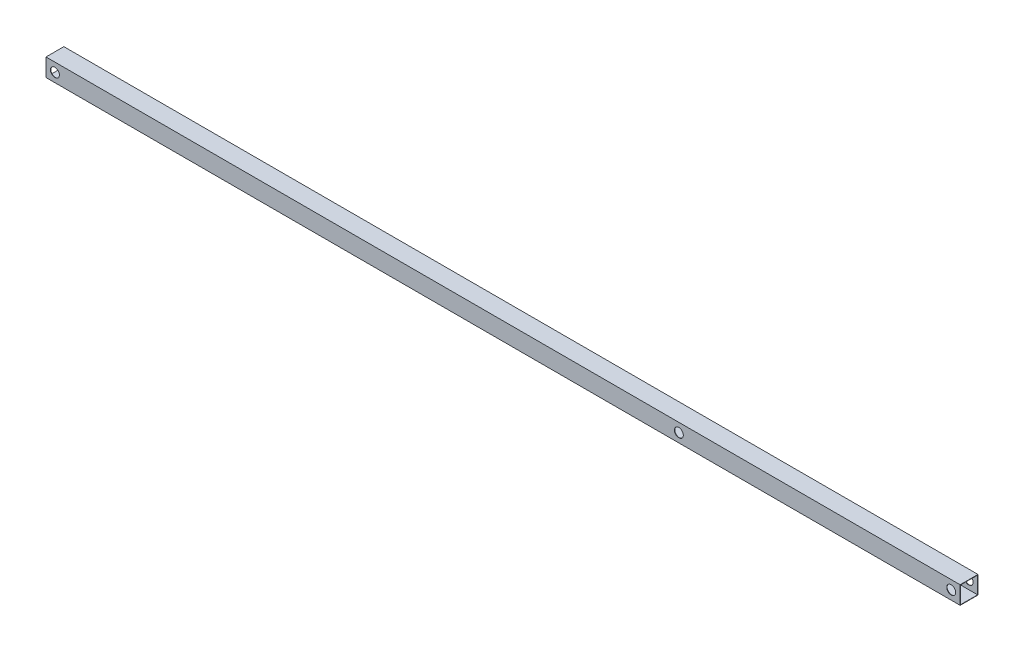
ISO-10303-21;
HEADER;
FILE_DESCRIPTION(('STEP AP214'),'2;1');
FILE_NAME('part.step','',(''),(''),'','','');
FILE_SCHEMA(('AUTOMOTIVE_DESIGN { 1 0 10303 214 1 1 1 1 }'));
ENDSEC;
DATA;
#1=APPLICATION_CONTEXT('core data for automotive mechanical design processes');
#2=APPLICATION_PROTOCOL_DEFINITION('international standard','automotive_design',2000,#1);
#3=PRODUCT_CONTEXT('',#1,'mechanical');
#4=PRODUCT('Part','Part','',(#3));
#5=PRODUCT_RELATED_PRODUCT_CATEGORY('part','',(#4));
#6=PRODUCT_DEFINITION_FORMATION('','',#4);
#7=PRODUCT_DEFINITION_CONTEXT('part definition',#1,'design');
#8=PRODUCT_DEFINITION('design','',#6,#7);
#9=PRODUCT_DEFINITION_SHAPE('','',#8);
#10=(LENGTH_UNIT() NAMED_UNIT(*) SI_UNIT(.MILLI.,.METRE.));
#11=(NAMED_UNIT(*) PLANE_ANGLE_UNIT() SI_UNIT($,.RADIAN.));
#12=(NAMED_UNIT(*) SI_UNIT($,.STERADIAN.) SOLID_ANGLE_UNIT());
#13=UNCERTAINTY_MEASURE_WITH_UNIT(LENGTH_MEASURE(1.E-05),#10,'distance_accuracy_value','');
#14=(GEOMETRIC_REPRESENTATION_CONTEXT(3) GLOBAL_UNCERTAINTY_ASSIGNED_CONTEXT((#13)) GLOBAL_UNIT_ASSIGNED_CONTEXT((#10,
#11,#12)) REPRESENTATION_CONTEXT('',''));
#15=CARTESIAN_POINT('',(0.,0.,0.));
#16=DIRECTION('',(0.,0.,1.));
#17=DIRECTION('',(1.,0.,0.));
#18=AXIS2_PLACEMENT_3D('',#15,#16,#17);
#19=CARTESIAN_POINT('',(1300.,12.7,12.7));
#20=DIRECTION('',(0.,-1.,0.));
#21=DIRECTION('',(0.,0.,-1.));
#22=AXIS2_PLACEMENT_3D('',#19,#20,#21);
#23=PLANE('',#22);
#24=DIRECTION('',(0.,0.,1.));
#25=VECTOR('',#24,1.);
#26=CARTESIAN_POINT('',(0.,12.7,12.7));
#27=LINE('',#26,#25);
#28=CARTESIAN_POINT('',(0.,12.7,-12.7));
#29=VERTEX_POINT('',#28);
#30=CARTESIAN_POINT('',(0.,12.7,12.7));
#31=VERTEX_POINT('',#30);
#32=EDGE_CURVE('E159',#29,#31,#27,.T.);
#33=ORIENTED_EDGE('',*,*,#32,.T.);
#34=DIRECTION('',(-1.,0.,0.));
#35=VECTOR('',#34,1.);
#36=CARTESIAN_POINT('',(1300.,12.7,12.7));
#37=LINE('',#36,#35);
#38=CARTESIAN_POINT('',(1300.,12.7,12.7));
#39=VERTEX_POINT('',#38);
#40=EDGE_CURVE('E12',#39,#31,#37,.T.);
#41=ORIENTED_EDGE('',*,*,#40,.F.);
#42=DIRECTION('',(0.,0.,1.));
#43=VECTOR('',#42,1.);
#44=CARTESIAN_POINT('',(1300.,12.7,12.7));
#45=LINE('',#44,#43);
#46=CARTESIAN_POINT('',(1300.,12.7,-12.7));
#47=VERTEX_POINT('',#46);
#48=EDGE_CURVE('E132',#47,#39,#45,.T.);
#49=ORIENTED_EDGE('',*,*,#48,.F.);
#50=DIRECTION('',(-1.,0.,0.));
#51=VECTOR('',#50,1.);
#52=CARTESIAN_POINT('',(1300.,12.7,-12.7));
#53=LINE('',#52,#51);
#54=EDGE_CURVE('E166',#47,#29,#53,.T.);
#55=ORIENTED_EDGE('',*,*,#54,.T.);
#56=EDGE_LOOP('',(#33,#41,#49,#55));
#57=FACE_BOUND('',#56,.T.);
#58=ADVANCED_FACE('F51',(#57),#23,.F.);
#59=CARTESIAN_POINT('',(1300.,12.7,12.7));
#60=DIRECTION('',(0.,0.,-1.));
#61=DIRECTION('',(-1.,0.,0.));
#62=AXIS2_PLACEMENT_3D('',#59,#60,#61);
#63=PLANE('',#62);
#64=CARTESIAN_POINT('',(900.,0.,12.7));
#65=DIRECTION('',(0.,0.,1.));
#66=DIRECTION('',(1.,0.,0.));
#67=AXIS2_PLACEMENT_3D('',#64,#65,#66);
#68=CIRCLE('',#67,6.34999999999994);
#69=CARTESIAN_POINT('',(906.35,0.,12.7));
#70=VERTEX_POINT('',#69);
#71=EDGE_CURVE('E229',#70,#70,#68,.T.);
#72=ORIENTED_EDGE('',*,*,#71,.F.);
#73=EDGE_LOOP('',(#72));
#74=FACE_BOUND('',#73,.T.);
#75=CARTESIAN_POINT('',(12.7,0.,12.7));
#76=DIRECTION('',(0.,0.,1.));
#77=DIRECTION('',(1.,0.,0.));
#78=AXIS2_PLACEMENT_3D('',#75,#76,#77);
#79=CIRCLE('',#78,6.35);
#80=CARTESIAN_POINT('',(19.05,0.,12.7));
#81=VERTEX_POINT('',#80);
#82=EDGE_CURVE('E223',#81,#81,#79,.T.);
#83=ORIENTED_EDGE('',*,*,#82,.F.);
#84=EDGE_LOOP('',(#83));
#85=FACE_BOUND('',#84,.T.);
#86=CARTESIAN_POINT('',(1287.3,0.,12.7));
#87=DIRECTION('',(0.,0.,1.));
#88=DIRECTION('',(1.,0.,0.));
#89=AXIS2_PLACEMENT_3D('',#86,#87,#88);
#90=CIRCLE('',#89,6.34999999999993);
#91=CARTESIAN_POINT('',(1293.65,0.,12.7));
#92=VERTEX_POINT('',#91);
#93=EDGE_CURVE('E205',#92,#92,#90,.T.);
#94=ORIENTED_EDGE('',*,*,#93,.F.);
#95=EDGE_LOOP('',(#94));
#96=FACE_BOUND('',#95,.T.);
#97=DIRECTION('',(0.,-1.,0.));
#98=VECTOR('',#97,1.);
#99=CARTESIAN_POINT('',(0.,12.7,12.7));
#100=LINE('',#99,#98);
#101=CARTESIAN_POINT('',(0.,-12.7,12.7));
#102=VERTEX_POINT('',#101);
#103=EDGE_CURVE('E137',#31,#102,#100,.T.);
#104=ORIENTED_EDGE('',*,*,#103,.T.);
#105=DIRECTION('',(-1.,0.,0.));
#106=VECTOR('',#105,1.);
#107=CARTESIAN_POINT('',(1300.,-12.7,12.7));
#108=LINE('',#107,#106);
#109=CARTESIAN_POINT('',(1300.,-12.7,12.7));
#110=VERTEX_POINT('',#109);
#111=EDGE_CURVE('E61',#110,#102,#108,.T.);
#112=ORIENTED_EDGE('',*,*,#111,.F.);
#113=DIRECTION('',(0.,-1.,0.));
#114=VECTOR('',#113,1.);
#115=CARTESIAN_POINT('',(1300.,12.7,12.7));
#116=LINE('',#115,#114);
#117=EDGE_CURVE('E126',#39,#110,#116,.T.);
#118=ORIENTED_EDGE('',*,*,#117,.F.);
#119=ORIENTED_EDGE('',*,*,#40,.T.);
#120=EDGE_LOOP('',(#104,#112,#118,#119));
#121=FACE_BOUND('',#120,.T.);
#122=ADVANCED_FACE('F136',(#74,#85,#96,#121),#63,.F.);
#123=CARTESIAN_POINT('',(1300.,-12.7,-12.7));
#124=DIRECTION('',(0.,1.,0.));
#125=DIRECTION('',(0.,0.,1.));
#126=AXIS2_PLACEMENT_3D('',#123,#124,#125);
#127=PLANE('',#126);
#128=DIRECTION('',(0.,0.,-1.));
#129=VECTOR('',#128,1.);
#130=CARTESIAN_POINT('',(0.,-12.7,-12.7));
#131=LINE('',#130,#129);
#132=CARTESIAN_POINT('',(0.,-12.7,-12.7));
#133=VERTEX_POINT('',#132);
#134=EDGE_CURVE('E99',#102,#133,#131,.T.);
#135=ORIENTED_EDGE('',*,*,#134,.T.);
#136=DIRECTION('',(-1.,0.,0.));
#137=VECTOR('',#136,1.);
#138=CARTESIAN_POINT('',(1300.,-12.7,-12.7));
#139=LINE('',#138,#137);
#140=CARTESIAN_POINT('',(1300.,-12.7,-12.7));
#141=VERTEX_POINT('',#140);
#142=EDGE_CURVE('E138',#141,#133,#139,.T.);
#143=ORIENTED_EDGE('',*,*,#142,.F.);
#144=DIRECTION('',(0.,0.,-1.));
#145=VECTOR('',#144,1.);
#146=CARTESIAN_POINT('',(1300.,-12.7,-12.7));
#147=LINE('',#146,#145);
#148=EDGE_CURVE('E130',#110,#141,#147,.T.);
#149=ORIENTED_EDGE('',*,*,#148,.F.);
#150=ORIENTED_EDGE('',*,*,#111,.T.);
#151=EDGE_LOOP('',(#135,#143,#149,#150));
#152=FACE_BOUND('',#151,.T.);
#153=ADVANCED_FACE('F140',(#152),#127,.F.);
#154=CARTESIAN_POINT('',(1300.,12.1412,12.1412));
#155=DIRECTION('',(0.,0.,-1.));
#156=DIRECTION('',(-1.,0.,0.));
#157=AXIS2_PLACEMENT_3D('',#154,#155,#156);
#158=PLANE('',#157);
#159=CARTESIAN_POINT('',(900.,0.,12.1412));
#160=DIRECTION('',(0.,0.,-1.));
#161=DIRECTION('',(-1.,0.,0.));
#162=AXIS2_PLACEMENT_3D('',#159,#160,#161);
#163=CIRCLE('',#162,6.34999999999994);
#164=CARTESIAN_POINT('',(893.65,0.,12.1412));
#165=VERTEX_POINT('',#164);
#166=EDGE_CURVE('E208',#165,#165,#163,.T.);
#167=ORIENTED_EDGE('',*,*,#166,.F.);
#168=EDGE_LOOP('',(#167));
#169=FACE_BOUND('',#168,.T.);
#170=CARTESIAN_POINT('',(12.7,0.,12.1412));
#171=DIRECTION('',(0.,0.,-1.));
#172=DIRECTION('',(-1.,0.,0.));
#173=AXIS2_PLACEMENT_3D('',#170,#171,#172);
#174=CIRCLE('',#173,6.35);
#175=CARTESIAN_POINT('',(6.35,0.,12.1412));
#176=VERTEX_POINT('',#175);
#177=EDGE_CURVE('E216',#176,#176,#174,.T.);
#178=ORIENTED_EDGE('',*,*,#177,.F.);
#179=EDGE_LOOP('',(#178));
#180=FACE_BOUND('',#179,.T.);
#181=CARTESIAN_POINT('',(1287.3,0.,12.1412));
#182=DIRECTION('',(0.,0.,-1.));
#183=DIRECTION('',(-1.,0.,0.));
#184=AXIS2_PLACEMENT_3D('',#181,#182,#183);
#185=CIRCLE('',#184,6.34999999999993);
#186=CARTESIAN_POINT('',(1280.95,0.,12.1412));
#187=VERTEX_POINT('',#186);
#188=EDGE_CURVE('E150',#187,#187,#185,.T.);
#189=ORIENTED_EDGE('',*,*,#188,.F.);
#190=EDGE_LOOP('',(#189));
#191=FACE_BOUND('',#190,.T.);
#192=DIRECTION('',(0.,-1.,0.));
#193=VECTOR('',#192,1.);
#194=CARTESIAN_POINT('',(0.,12.1412,12.1412));
#195=LINE('',#194,#193);
#196=CARTESIAN_POINT('',(0.,12.1412,12.1412));
#197=VERTEX_POINT('',#196);
#198=CARTESIAN_POINT('',(0.,-12.1412,12.1412));
#199=VERTEX_POINT('',#198);
#200=EDGE_CURVE('E146',#197,#199,#195,.T.);
#201=ORIENTED_EDGE('',*,*,#200,.F.);
#202=DIRECTION('',(-1.,0.,0.));
#203=VECTOR('',#202,1.);
#204=CARTESIAN_POINT('',(1300.,12.1412,12.1412));
#205=LINE('',#204,#203);
#206=CARTESIAN_POINT('',(1300.,12.1412,12.1412));
#207=VERTEX_POINT('',#206);
#208=EDGE_CURVE('E55',#207,#197,#205,.T.);
#209=ORIENTED_EDGE('',*,*,#208,.F.);
#210=DIRECTION('',(0.,-1.,0.));
#211=VECTOR('',#210,1.);
#212=CARTESIAN_POINT('',(1300.,12.1412,12.1412));
#213=LINE('',#212,#211);
#214=CARTESIAN_POINT('',(1300.,-12.1412,12.1412));
#215=VERTEX_POINT('',#214);
#216=EDGE_CURVE('E165',#207,#215,#213,.T.);
#217=ORIENTED_EDGE('',*,*,#216,.T.);
#218=DIRECTION('',(-1.,0.,0.));
#219=VECTOR('',#218,1.);
#220=CARTESIAN_POINT('',(1300.,-12.1412,12.1412));
#221=LINE('',#220,#219);
#222=EDGE_CURVE('E142',#215,#199,#221,.T.);
#223=ORIENTED_EDGE('',*,*,#222,.T.);
#224=EDGE_LOOP('',(#201,#209,#217,#223));
#225=FACE_BOUND('',#224,.T.);
#226=ADVANCED_FACE('F53',(#169,#180,#191,#225),#158,.T.);
#227=CARTESIAN_POINT('',(1300.,12.1412,12.1412));
#228=DIRECTION('',(0.,-1.,0.));
#229=DIRECTION('',(0.,0.,-1.));
#230=AXIS2_PLACEMENT_3D('',#227,#228,#229);
#231=PLANE('',#230);
#232=DIRECTION('',(0.,0.,1.));
#233=VECTOR('',#232,1.);
#234=CARTESIAN_POINT('',(0.,12.1412,12.1412));
#235=LINE('',#234,#233);
#236=CARTESIAN_POINT('',(0.,12.1412,-12.1412));
#237=VERTEX_POINT('',#236);
#238=EDGE_CURVE('E149',#237,#197,#235,.T.);
#239=ORIENTED_EDGE('',*,*,#238,.F.);
#240=DIRECTION('',(-1.,0.,0.));
#241=VECTOR('',#240,1.);
#242=CARTESIAN_POINT('',(1300.,12.1412,-12.1412));
#243=LINE('',#242,#241);
#244=CARTESIAN_POINT('',(1300.,12.1412,-12.1412));
#245=VERTEX_POINT('',#244);
#246=EDGE_CURVE('E171',#245,#237,#243,.T.);
#247=ORIENTED_EDGE('',*,*,#246,.F.);
#248=DIRECTION('',(0.,0.,1.));
#249=VECTOR('',#248,1.);
#250=CARTESIAN_POINT('',(1300.,12.1412,12.1412));
#251=LINE('',#250,#249);
#252=EDGE_CURVE('E180',#245,#207,#251,.T.);
#253=ORIENTED_EDGE('',*,*,#252,.T.);
#254=ORIENTED_EDGE('',*,*,#208,.T.);
#255=EDGE_LOOP('',(#239,#247,#253,#254));
#256=FACE_BOUND('',#255,.T.);
#257=ADVANCED_FACE('F178',(#256),#231,.T.);
#258=CARTESIAN_POINT('',(1300.,-12.1412,-12.1412));
#259=DIRECTION('',(0.,0.,1.));
#260=DIRECTION('',(1.,0.,0.));
#261=AXIS2_PLACEMENT_3D('',#258,#259,#260);
#262=PLANE('',#261);
#263=CARTESIAN_POINT('',(900.,0.,-12.1412));
#264=DIRECTION('',(0.,0.,1.));
#265=DIRECTION('',(1.,0.,0.));
#266=AXIS2_PLACEMENT_3D('',#263,#264,#265);
#267=CIRCLE('',#266,6.34999999999994);
#268=CARTESIAN_POINT('',(906.35,0.,-12.1412));
#269=VERTEX_POINT('',#268);
#270=EDGE_CURVE('E213',#269,#269,#267,.T.);
#271=ORIENTED_EDGE('',*,*,#270,.F.);
#272=EDGE_LOOP('',(#271));
#273=FACE_BOUND('',#272,.T.);
#274=CARTESIAN_POINT('',(12.7,0.,-12.1412));
#275=DIRECTION('',(0.,0.,1.));
#276=DIRECTION('',(1.,0.,0.));
#277=AXIS2_PLACEMENT_3D('',#274,#275,#276);
#278=CIRCLE('',#277,6.35);
#279=CARTESIAN_POINT('',(19.05,0.,-12.1412));
#280=VERTEX_POINT('',#279);
#281=EDGE_CURVE('E219',#280,#280,#278,.T.);
#282=ORIENTED_EDGE('',*,*,#281,.F.);
#283=EDGE_LOOP('',(#282));
#284=FACE_BOUND('',#283,.T.);
#285=CARTESIAN_POINT('',(1287.3,0.,-12.1412));
#286=DIRECTION('',(0.,0.,1.));
#287=DIRECTION('',(1.,0.,0.));
#288=AXIS2_PLACEMENT_3D('',#285,#286,#287);
#289=CIRCLE('',#288,6.34999999999993);
#290=CARTESIAN_POINT('',(1293.65,0.,-12.1412));
#291=VERTEX_POINT('',#290);
#292=EDGE_CURVE('E201',#291,#291,#289,.T.);
#293=ORIENTED_EDGE('',*,*,#292,.F.);
#294=EDGE_LOOP('',(#293));
#295=FACE_BOUND('',#294,.T.);
#296=DIRECTION('',(0.,1.,0.));
#297=VECTOR('',#296,1.);
#298=CARTESIAN_POINT('',(0.,-12.1412,-12.1412));
#299=LINE('',#298,#297);
#300=CARTESIAN_POINT('',(0.,-12.1412,-12.1412));
#301=VERTEX_POINT('',#300);
#302=EDGE_CURVE('E153',#301,#237,#299,.T.);
#303=ORIENTED_EDGE('',*,*,#302,.F.);
#304=DIRECTION('',(-1.,0.,0.));
#305=VECTOR('',#304,1.);
#306=CARTESIAN_POINT('',(1300.,-12.1412,-12.1412));
#307=LINE('',#306,#305);
#308=CARTESIAN_POINT('',(1300.,-12.1412,-12.1412));
#309=VERTEX_POINT('',#308);
#310=EDGE_CURVE('E170',#309,#301,#307,.T.);
#311=ORIENTED_EDGE('',*,*,#310,.F.);
#312=DIRECTION('',(0.,1.,0.));
#313=VECTOR('',#312,1.);
#314=CARTESIAN_POINT('',(1300.,-12.1412,-12.1412));
#315=LINE('',#314,#313);
#316=EDGE_CURVE('E187',#309,#245,#315,.T.);
#317=ORIENTED_EDGE('',*,*,#316,.T.);
#318=ORIENTED_EDGE('',*,*,#246,.T.);
#319=EDGE_LOOP('',(#303,#311,#317,#318));
#320=FACE_BOUND('',#319,.T.);
#321=ADVANCED_FACE('F185',(#273,#284,#295,#320),#262,.T.);
#322=CARTESIAN_POINT('',(1300.,-12.1412,-12.1412));
#323=DIRECTION('',(0.,1.,0.));
#324=DIRECTION('',(0.,0.,1.));
#325=AXIS2_PLACEMENT_3D('',#322,#323,#324);
#326=PLANE('',#325);
#327=DIRECTION('',(0.,0.,-1.));
#328=VECTOR('',#327,1.);
#329=CARTESIAN_POINT('',(0.,-12.1412,-12.1412));
#330=LINE('',#329,#328);
#331=EDGE_CURVE('E156',#199,#301,#330,.T.);
#332=ORIENTED_EDGE('',*,*,#331,.F.);
#333=ORIENTED_EDGE('',*,*,#222,.F.);
#334=DIRECTION('',(0.,0.,-1.));
#335=VECTOR('',#334,1.);
#336=CARTESIAN_POINT('',(1300.,-12.1412,-12.1412));
#337=LINE('',#336,#335);
#338=EDGE_CURVE('E192',#215,#309,#337,.T.);
#339=ORIENTED_EDGE('',*,*,#338,.T.);
#340=ORIENTED_EDGE('',*,*,#310,.T.);
#341=EDGE_LOOP('',(#332,#333,#339,#340));
#342=FACE_BOUND('',#341,.T.);
#343=ADVANCED_FACE('F194',(#342),#326,.T.);
#344=CARTESIAN_POINT('',(1300.,-12.7,-12.7));
#345=DIRECTION('',(0.,0.,1.));
#346=DIRECTION('',(0.,-1.,0.));
#347=AXIS2_PLACEMENT_3D('',#344,#345,#346);
#348=PLANE('',#347);
#349=CARTESIAN_POINT('',(900.,0.,-12.7));
#350=DIRECTION('',(0.,0.,1.));
#351=DIRECTION('',(1.,0.,0.));
#352=AXIS2_PLACEMENT_3D('',#349,#350,#351);
#353=CIRCLE('',#352,6.34999999999994);
#354=CARTESIAN_POINT('',(906.35,0.,-12.7));
#355=VERTEX_POINT('',#354);
#356=EDGE_CURVE('E222',#355,#355,#353,.T.);
#357=ORIENTED_EDGE('',*,*,#356,.T.);
#358=EDGE_LOOP('',(#357));
#359=FACE_BOUND('',#358,.T.);
#360=CARTESIAN_POINT('',(12.7,0.,-12.7));
#361=DIRECTION('',(0.,0.,1.));
#362=DIRECTION('',(1.,0.,0.));
#363=AXIS2_PLACEMENT_3D('',#360,#361,#362);
#364=CIRCLE('',#363,6.35);
#365=CARTESIAN_POINT('',(19.05,0.,-12.7));
#366=VERTEX_POINT('',#365);
#367=EDGE_CURVE('E226',#366,#366,#364,.T.);
#368=ORIENTED_EDGE('',*,*,#367,.T.);
#369=EDGE_LOOP('',(#368));
#370=FACE_BOUND('',#369,.T.);
#371=CARTESIAN_POINT('',(1287.3,0.,-12.7));
#372=DIRECTION('',(0.,0.,1.));
#373=DIRECTION('',(1.,0.,0.));
#374=AXIS2_PLACEMENT_3D('',#371,#372,#373);
#375=CIRCLE('',#374,6.34999999999993);
#376=CARTESIAN_POINT('',(1293.65,0.,-12.7));
#377=VERTEX_POINT('',#376);
#378=EDGE_CURVE('E204',#377,#377,#375,.T.);
#379=ORIENTED_EDGE('',*,*,#378,.T.);
#380=EDGE_LOOP('',(#379));
#381=FACE_BOUND('',#380,.T.);
#382=DIRECTION('',(0.,1.,0.));
#383=VECTOR('',#382,1.);
#384=CARTESIAN_POINT('',(0.,-12.7,-12.7));
#385=LINE('',#384,#383);
#386=EDGE_CURVE('E105',#133,#29,#385,.T.);
#387=ORIENTED_EDGE('',*,*,#386,.T.);
#388=ORIENTED_EDGE('',*,*,#54,.F.);
#389=DIRECTION('',(0.,1.,0.));
#390=VECTOR('',#389,1.);
#391=CARTESIAN_POINT('',(1300.,-12.7,-12.7));
#392=LINE('',#391,#390);
#393=EDGE_CURVE('E70',#141,#47,#392,.T.);
#394=ORIENTED_EDGE('',*,*,#393,.F.);
#395=ORIENTED_EDGE('',*,*,#142,.T.);
#396=EDGE_LOOP('',(#387,#388,#394,#395));
#397=FACE_BOUND('',#396,.T.);
#398=ADVANCED_FACE('F235',(#359,#370,#381,#397),#348,.F.);
#399=CARTESIAN_POINT('',(1300.,0.,0.));
#400=DIRECTION('',(1.,0.,0.));
#401=DIRECTION('',(0.,0.,-1.));
#402=AXIS2_PLACEMENT_3D('',#399,#400,#401);
#403=PLANE('',#402);
#404=ORIENTED_EDGE('',*,*,#216,.F.);
#405=ORIENTED_EDGE('',*,*,#252,.F.);
#406=ORIENTED_EDGE('',*,*,#316,.F.);
#407=ORIENTED_EDGE('',*,*,#338,.F.);
#408=EDGE_LOOP('',(#404,#405,#406,#407));
#409=FACE_BOUND('',#408,.T.);
#410=ORIENTED_EDGE('',*,*,#48,.T.);
#411=ORIENTED_EDGE('',*,*,#117,.T.);
#412=ORIENTED_EDGE('',*,*,#148,.T.);
#413=ORIENTED_EDGE('',*,*,#393,.T.);
#414=EDGE_LOOP('',(#410,#411,#412,#413));
#415=FACE_BOUND('',#414,.T.);
#416=ADVANCED_FACE('F128',(#409,#415),#403,.T.);
#417=CARTESIAN_POINT('',(0.,0.,0.));
#418=DIRECTION('',(1.,0.,0.));
#419=DIRECTION('',(0.,0.,-1.));
#420=AXIS2_PLACEMENT_3D('',#417,#418,#419);
#421=PLANE('',#420);
#422=ORIENTED_EDGE('',*,*,#200,.T.);
#423=ORIENTED_EDGE('',*,*,#331,.T.);
#424=ORIENTED_EDGE('',*,*,#302,.T.);
#425=ORIENTED_EDGE('',*,*,#238,.T.);
#426=EDGE_LOOP('',(#422,#423,#424,#425));
#427=FACE_BOUND('',#426,.T.);
#428=ORIENTED_EDGE('',*,*,#32,.F.);
#429=ORIENTED_EDGE('',*,*,#386,.F.);
#430=ORIENTED_EDGE('',*,*,#134,.F.);
#431=ORIENTED_EDGE('',*,*,#103,.F.);
#432=EDGE_LOOP('',(#428,#429,#430,#431));
#433=FACE_BOUND('',#432,.T.);
#434=ADVANCED_FACE('F183',(#427,#433),#421,.F.);
#435=CARTESIAN_POINT('',(1287.3,0.,-12.7));
#436=DIRECTION('',(0.,0.,1.));
#437=DIRECTION('',(1.,0.,0.));
#438=AXIS2_PLACEMENT_3D('',#435,#436,#437);
#439=CYLINDRICAL_SURFACE('',#438,6.34999999999993);
#440=ORIENTED_EDGE('',*,*,#292,.T.);
#441=EDGE_LOOP('',(#440));
#442=FACE_BOUND('',#441,.T.);
#443=ORIENTED_EDGE('',*,*,#378,.F.);
#444=EDGE_LOOP('',(#443));
#445=FACE_BOUND('',#444,.T.);
#446=ADVANCED_FACE('F285',(#442,#445),#439,.F.);
#447=ORIENTED_EDGE('',*,*,#188,.T.);
#448=EDGE_LOOP('',(#447));
#449=FACE_BOUND('',#448,.T.);
#450=ORIENTED_EDGE('',*,*,#93,.T.);
#451=EDGE_LOOP('',(#450));
#452=FACE_BOUND('',#451,.T.);
#453=ADVANCED_FACE('F251',(#449,#452),#439,.F.);
#454=CARTESIAN_POINT('',(12.7,0.,-12.7));
#455=DIRECTION('',(0.,0.,1.));
#456=DIRECTION('',(1.,0.,0.));
#457=AXIS2_PLACEMENT_3D('',#454,#455,#456);
#458=CYLINDRICAL_SURFACE('',#457,6.35);
#459=ORIENTED_EDGE('',*,*,#281,.T.);
#460=EDGE_LOOP('',(#459));
#461=FACE_BOUND('',#460,.T.);
#462=ORIENTED_EDGE('',*,*,#367,.F.);
#463=EDGE_LOOP('',(#462));
#464=FACE_BOUND('',#463,.T.);
#465=ADVANCED_FACE('F241',(#461,#464),#458,.F.);
#466=CARTESIAN_POINT('',(900.,0.,-12.7));
#467=DIRECTION('',(0.,0.,1.));
#468=DIRECTION('',(1.,0.,0.));
#469=AXIS2_PLACEMENT_3D('',#466,#467,#468);
#470=CYLINDRICAL_SURFACE('',#469,6.34999999999994);
#471=ORIENTED_EDGE('',*,*,#270,.T.);
#472=EDGE_LOOP('',(#471));
#473=FACE_BOUND('',#472,.T.);
#474=ORIENTED_EDGE('',*,*,#356,.F.);
#475=EDGE_LOOP('',(#474));
#476=FACE_BOUND('',#475,.T.);
#477=ADVANCED_FACE('F238',(#473,#476),#470,.F.);
#478=ORIENTED_EDGE('',*,*,#177,.T.);
#479=EDGE_LOOP('',(#478));
#480=FACE_BOUND('',#479,.T.);
#481=ORIENTED_EDGE('',*,*,#82,.T.);
#482=EDGE_LOOP('',(#481));
#483=FACE_BOUND('',#482,.T.);
#484=ADVANCED_FACE('F240',(#480,#483),#458,.F.);
#485=ORIENTED_EDGE('',*,*,#166,.T.);
#486=EDGE_LOOP('',(#485));
#487=FACE_BOUND('',#486,.T.);
#488=ORIENTED_EDGE('',*,*,#71,.T.);
#489=EDGE_LOOP('',(#488));
#490=FACE_BOUND('',#489,.T.);
#491=ADVANCED_FACE('F244',(#487,#490),#470,.F.);
#492=CLOSED_SHELL('',(#58,#122,#153,#226,#257,#321,#343,#398,#416,#434,#446,#453,#465,#477,#484,#491));
#493=MANIFOLD_SOLID_BREP('B2',#492);
#494=ADVANCED_BREP_SHAPE_REPRESENTATION('',(#18,#493),#14);
#495=SHAPE_DEFINITION_REPRESENTATION(#9,#494);
ENDSEC;
END-ISO-10303-21;
